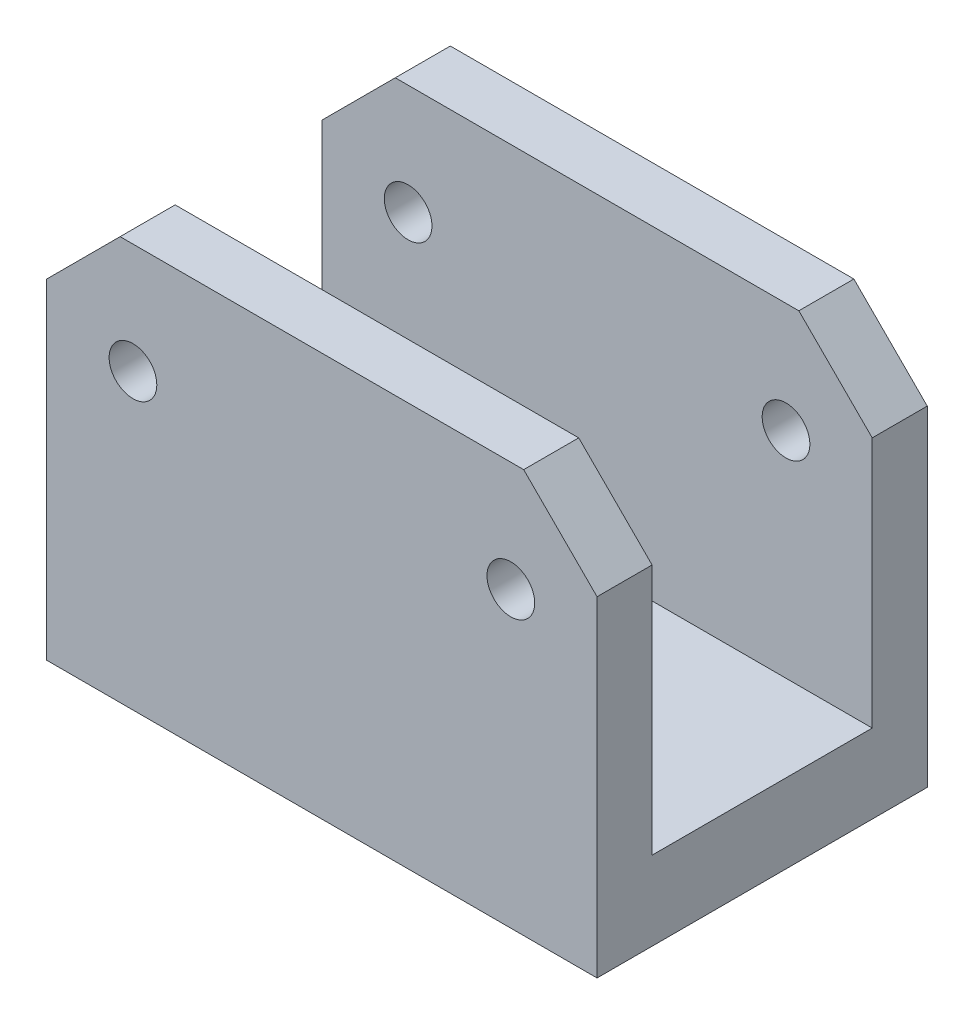
ISO-10303-21;
HEADER;
FILE_DESCRIPTION(('STEP AP214'),'2;1');
FILE_NAME('part.step','',(''),(''),'','','');
FILE_SCHEMA(('AUTOMOTIVE_DESIGN { 1 0 10303 214 1 1 1 1 }'));
ENDSEC;
DATA;
#1=APPLICATION_CONTEXT('core data for automotive mechanical design processes');
#2=APPLICATION_PROTOCOL_DEFINITION('international standard','automotive_design',2000,#1);
#3=PRODUCT_CONTEXT('',#1,'mechanical');
#4=PRODUCT('Part','Part','',(#3));
#5=PRODUCT_RELATED_PRODUCT_CATEGORY('part','',(#4));
#6=PRODUCT_DEFINITION_FORMATION('','',#4);
#7=PRODUCT_DEFINITION_CONTEXT('part definition',#1,'design');
#8=PRODUCT_DEFINITION('design','',#6,#7);
#9=PRODUCT_DEFINITION_SHAPE('','',#8);
#10=(LENGTH_UNIT() NAMED_UNIT(*) SI_UNIT(.MILLI.,.METRE.));
#11=(NAMED_UNIT(*) PLANE_ANGLE_UNIT() SI_UNIT($,.RADIAN.));
#12=(NAMED_UNIT(*) SI_UNIT($,.STERADIAN.) SOLID_ANGLE_UNIT());
#13=UNCERTAINTY_MEASURE_WITH_UNIT(LENGTH_MEASURE(1.E-05),#10,'distance_accuracy_value','');
#14=(GEOMETRIC_REPRESENTATION_CONTEXT(3) GLOBAL_UNCERTAINTY_ASSIGNED_CONTEXT((#13)) GLOBAL_UNIT_ASSIGNED_CONTEXT((#10,
#11,#12)) REPRESENTATION_CONTEXT('',''));
#15=CARTESIAN_POINT('',(0.,0.,0.));
#16=DIRECTION('',(0.,0.,1.));
#17=DIRECTION('',(1.,0.,0.));
#18=AXIS2_PLACEMENT_3D('',#15,#16,#17);
#19=CARTESIAN_POINT('',(15.,7.,9.));
#20=DIRECTION('',(-0.707106781186547,-0.707106781186547,0.));
#21=DIRECTION('',(0.707106781186548,-0.707106781186548,0.));
#22=AXIS2_PLACEMENT_3D('',#19,#20,#21);
#23=PLANE('',#22);
#24=DIRECTION('',(0.707106781186548,-0.707106781186548,0.));
#25=VECTOR('',#24,1.);
#26=CARTESIAN_POINT('',(15.,7.,6.));
#27=LINE('',#26,#25);
#28=CARTESIAN_POINT('',(11.,11.,6.));
#29=VERTEX_POINT('',#28);
#30=CARTESIAN_POINT('',(15.,6.99999999999998,6.));
#31=VERTEX_POINT('',#30);
#32=EDGE_CURVE('E192',#29,#31,#27,.T.);
#33=ORIENTED_EDGE('',*,*,#32,.F.);
#34=DIRECTION('',(0.,0.,-1.));
#35=VECTOR('',#34,1.);
#36=CARTESIAN_POINT('',(11.,11.,9.));
#37=LINE('',#36,#35);
#38=CARTESIAN_POINT('',(11.,11.,9.));
#39=VERTEX_POINT('',#38);
#40=EDGE_CURVE('E164',#39,#29,#37,.T.);
#41=ORIENTED_EDGE('',*,*,#40,.F.);
#42=DIRECTION('',(-0.707106781186548,0.707106781186548,0.));
#43=VECTOR('',#42,1.);
#44=CARTESIAN_POINT('',(15.,7.,9.));
#45=LINE('',#44,#43);
#46=CARTESIAN_POINT('',(15.,7.,9.));
#47=VERTEX_POINT('',#46);
#48=EDGE_CURVE('E100',#47,#39,#45,.T.);
#49=ORIENTED_EDGE('',*,*,#48,.F.);
#50=DIRECTION('',(0.,0.,-1.));
#51=VECTOR('',#50,1.);
#52=CARTESIAN_POINT('',(15.,7.,9.));
#53=LINE('',#52,#51);
#54=EDGE_CURVE('E11',#47,#31,#53,.T.);
#55=ORIENTED_EDGE('',*,*,#54,.T.);
#56=EDGE_LOOP('',(#33,#41,#49,#55));
#57=FACE_BOUND('',#56,.T.);
#58=ADVANCED_FACE('F39',(#57),#23,.F.);
#59=CARTESIAN_POINT('',(-11.,11.,9.));
#60=DIRECTION('',(0.,-1.,0.));
#61=DIRECTION('',(0.,0.,-1.));
#62=AXIS2_PLACEMENT_3D('',#59,#60,#61);
#63=PLANE('',#62);
#64=DIRECTION('',(1.,0.,0.));
#65=VECTOR('',#64,1.);
#66=CARTESIAN_POINT('',(-11.,11.,6.));
#67=LINE('',#66,#65);
#68=CARTESIAN_POINT('',(-11.,11.,6.));
#69=VERTEX_POINT('',#68);
#70=EDGE_CURVE('E189',#69,#29,#67,.T.);
#71=ORIENTED_EDGE('',*,*,#70,.F.);
#72=DIRECTION('',(0.,0.,-1.));
#73=VECTOR('',#72,1.);
#74=CARTESIAN_POINT('',(-11.,11.,9.));
#75=LINE('',#74,#73);
#76=CARTESIAN_POINT('',(-11.,11.,9.));
#77=VERTEX_POINT('',#76);
#78=EDGE_CURVE('E161',#77,#69,#75,.T.);
#79=ORIENTED_EDGE('',*,*,#78,.F.);
#80=DIRECTION('',(-1.,0.,0.));
#81=VECTOR('',#80,1.);
#82=CARTESIAN_POINT('',(-11.,11.,9.));
#83=LINE('',#82,#81);
#84=EDGE_CURVE('E117',#39,#77,#83,.T.);
#85=ORIENTED_EDGE('',*,*,#84,.F.);
#86=ORIENTED_EDGE('',*,*,#40,.T.);
#87=EDGE_LOOP('',(#71,#79,#85,#86));
#88=FACE_BOUND('',#87,.T.);
#89=ADVANCED_FACE('F225',(#88),#63,.F.);
#90=CARTESIAN_POINT('',(-15.,7.,9.));
#91=DIRECTION('',(0.707106781186547,-0.707106781186547,0.));
#92=DIRECTION('',(0.707106781186548,0.707106781186548,0.));
#93=AXIS2_PLACEMENT_3D('',#90,#91,#92);
#94=PLANE('',#93);
#95=DIRECTION('',(0.707106781186548,0.707106781186548,0.));
#96=VECTOR('',#95,1.);
#97=CARTESIAN_POINT('',(-15.,7.,6.));
#98=LINE('',#97,#96);
#99=CARTESIAN_POINT('',(-15.,7.,6.));
#100=VERTEX_POINT('',#99);
#101=EDGE_CURVE('E128',#100,#69,#98,.T.);
#102=ORIENTED_EDGE('',*,*,#101,.F.);
#103=DIRECTION('',(0.,0.,-1.));
#104=VECTOR('',#103,1.);
#105=CARTESIAN_POINT('',(-15.,7.,9.));
#106=LINE('',#105,#104);
#107=CARTESIAN_POINT('',(-15.,7.,9.));
#108=VERTEX_POINT('',#107);
#109=EDGE_CURVE('E124',#108,#100,#106,.T.);
#110=ORIENTED_EDGE('',*,*,#109,.F.);
#111=DIRECTION('',(-0.707106781186548,-0.707106781186548,0.));
#112=VECTOR('',#111,1.);
#113=CARTESIAN_POINT('',(-15.,7.,9.));
#114=LINE('',#113,#112);
#115=EDGE_CURVE('E109',#77,#108,#114,.T.);
#116=ORIENTED_EDGE('',*,*,#115,.F.);
#117=ORIENTED_EDGE('',*,*,#78,.T.);
#118=EDGE_LOOP('',(#102,#110,#116,#117));
#119=FACE_BOUND('',#118,.T.);
#120=ADVANCED_FACE('F125',(#119),#94,.F.);
#121=CARTESIAN_POINT('',(-10.3,5.,9.));
#122=DIRECTION('',(0.,0.,-1.));
#123=DIRECTION('',(-1.,0.,0.));
#124=AXIS2_PLACEMENT_3D('',#121,#122,#123);
#125=CYLINDRICAL_SURFACE('',#124,1.3);
#126=CARTESIAN_POINT('',(-10.3,5.,9.));
#127=DIRECTION('',(0.,0.,1.));
#128=DIRECTION('',(1.,0.,0.));
#129=AXIS2_PLACEMENT_3D('',#126,#127,#128);
#130=CIRCLE('',#129,1.3);
#131=CARTESIAN_POINT('',(-9.,5.,9.));
#132=VERTEX_POINT('',#131);
#133=EDGE_CURVE('E146',#132,#132,#130,.T.);
#134=ORIENTED_EDGE('',*,*,#133,.T.);
#135=EDGE_LOOP('',(#134));
#136=FACE_BOUND('',#135,.T.);
#137=CARTESIAN_POINT('',(-10.3,5.,6.));
#138=DIRECTION('',(0.,0.,-1.));
#139=DIRECTION('',(-1.,0.,0.));
#140=AXIS2_PLACEMENT_3D('',#137,#138,#139);
#141=CIRCLE('',#140,1.3);
#142=CARTESIAN_POINT('',(-11.6,5.,6.));
#143=VERTEX_POINT('',#142);
#144=EDGE_CURVE('E168',#143,#143,#141,.T.);
#145=ORIENTED_EDGE('',*,*,#144,.T.);
#146=EDGE_LOOP('',(#145));
#147=FACE_BOUND('',#146,.T.);
#148=ADVANCED_FACE('F322',(#136,#147),#125,.F.);
#149=CARTESIAN_POINT('',(10.3,5.,9.));
#150=DIRECTION('',(0.,0.,-1.));
#151=DIRECTION('',(-1.,0.,0.));
#152=AXIS2_PLACEMENT_3D('',#149,#150,#151);
#153=CYLINDRICAL_SURFACE('',#152,1.3);
#154=CARTESIAN_POINT('',(10.3,5.,9.));
#155=DIRECTION('',(0.,0.,1.));
#156=DIRECTION('',(-1.,0.,0.));
#157=AXIS2_PLACEMENT_3D('',#154,#155,#156);
#158=CIRCLE('',#157,1.3);
#159=CARTESIAN_POINT('',(9.,5.,9.));
#160=VERTEX_POINT('',#159);
#161=EDGE_CURVE('E208',#160,#160,#158,.T.);
#162=ORIENTED_EDGE('',*,*,#161,.T.);
#163=EDGE_LOOP('',(#162));
#164=FACE_BOUND('',#163,.T.);
#165=CARTESIAN_POINT('',(10.3,5.,6.));
#166=DIRECTION('',(0.,0.,-1.));
#167=DIRECTION('',(-1.,0.,0.));
#168=AXIS2_PLACEMENT_3D('',#165,#166,#167);
#169=CIRCLE('',#168,1.3);
#170=CARTESIAN_POINT('',(9.,5.,6.));
#171=VERTEX_POINT('',#170);
#172=EDGE_CURVE('E166',#171,#171,#169,.T.);
#173=ORIENTED_EDGE('',*,*,#172,.T.);
#174=EDGE_LOOP('',(#173));
#175=FACE_BOUND('',#174,.T.);
#176=ADVANCED_FACE('F334',(#164,#175),#153,.F.);
#177=CARTESIAN_POINT('',(0.,0.,9.));
#178=DIRECTION('',(0.,0.,1.));
#179=DIRECTION('',(1.,0.,0.));
#180=AXIS2_PLACEMENT_3D('',#177,#178,#179);
#181=PLANE('',#180);
#182=ORIENTED_EDGE('',*,*,#133,.F.);
#183=EDGE_LOOP('',(#182));
#184=FACE_BOUND('',#183,.T.);
#185=DIRECTION('',(0.,1.,0.));
#186=VECTOR('',#185,1.);
#187=CARTESIAN_POINT('',(15.,7.,9.));
#188=LINE('',#187,#186);
#189=CARTESIAN_POINT('',(15.,-11.,9.));
#190=VERTEX_POINT('',#189);
#191=EDGE_CURVE('E158',#190,#47,#188,.T.);
#192=ORIENTED_EDGE('',*,*,#191,.T.);
#193=ORIENTED_EDGE('',*,*,#48,.T.);
#194=ORIENTED_EDGE('',*,*,#84,.T.);
#195=ORIENTED_EDGE('',*,*,#115,.T.);
#196=DIRECTION('',(0.,-1.,0.));
#197=VECTOR('',#196,1.);
#198=CARTESIAN_POINT('',(-15.,7.,9.));
#199=LINE('',#198,#197);
#200=CARTESIAN_POINT('',(-15.,-11.,9.));
#201=VERTEX_POINT('',#200);
#202=EDGE_CURVE('E114',#108,#201,#199,.T.);
#203=ORIENTED_EDGE('',*,*,#202,.T.);
#204=DIRECTION('',(1.,0.,0.));
#205=VECTOR('',#204,1.);
#206=CARTESIAN_POINT('',(-15.,-11.,9.));
#207=LINE('',#206,#205);
#208=EDGE_CURVE('E65',#201,#190,#207,.T.);
#209=ORIENTED_EDGE('',*,*,#208,.T.);
#210=EDGE_LOOP('',(#192,#193,#194,#195,#203,#209));
#211=FACE_BOUND('',#210,.T.);
#212=ORIENTED_EDGE('',*,*,#161,.F.);
#213=EDGE_LOOP('',(#212));
#214=FACE_BOUND('',#213,.T.);
#215=ADVANCED_FACE('F111',(#184,#211,#214),#181,.T.);
#216=CARTESIAN_POINT('',(0.,0.,-9.));
#217=DIRECTION('',(0.,0.,1.));
#218=DIRECTION('',(1.,0.,0.));
#219=AXIS2_PLACEMENT_3D('',#216,#217,#218);
#220=PLANE('',#219);
#221=DIRECTION('',(0.,1.,0.));
#222=VECTOR('',#221,1.);
#223=CARTESIAN_POINT('',(15.,7.,-9.));
#224=LINE('',#223,#222);
#225=CARTESIAN_POINT('',(15.,-11.,-9.));
#226=VERTEX_POINT('',#225);
#227=CARTESIAN_POINT('',(15.,7.,-9.));
#228=VERTEX_POINT('',#227);
#229=EDGE_CURVE('E142',#226,#228,#224,.T.);
#230=ORIENTED_EDGE('',*,*,#229,.F.);
#231=DIRECTION('',(1.,0.,0.));
#232=VECTOR('',#231,1.);
#233=CARTESIAN_POINT('',(-15.,-11.,-9.));
#234=LINE('',#233,#232);
#235=CARTESIAN_POINT('',(-15.,-11.,-9.));
#236=VERTEX_POINT('',#235);
#237=EDGE_CURVE('E92',#236,#226,#234,.T.);
#238=ORIENTED_EDGE('',*,*,#237,.F.);
#239=DIRECTION('',(0.,-1.,0.));
#240=VECTOR('',#239,1.);
#241=CARTESIAN_POINT('',(-15.,7.,-9.));
#242=LINE('',#241,#240);
#243=CARTESIAN_POINT('',(-15.,7.,-9.));
#244=VERTEX_POINT('',#243);
#245=EDGE_CURVE('E155',#244,#236,#242,.T.);
#246=ORIENTED_EDGE('',*,*,#245,.F.);
#247=DIRECTION('',(-0.707106781186548,-0.707106781186548,0.));
#248=VECTOR('',#247,1.);
#249=CARTESIAN_POINT('',(-15.,7.,-9.));
#250=LINE('',#249,#248);
#251=CARTESIAN_POINT('',(-11.,11.,-9.));
#252=VERTEX_POINT('',#251);
#253=EDGE_CURVE('E152',#252,#244,#250,.T.);
#254=ORIENTED_EDGE('',*,*,#253,.F.);
#255=DIRECTION('',(-1.,0.,0.));
#256=VECTOR('',#255,1.);
#257=CARTESIAN_POINT('',(-11.,11.,-9.));
#258=LINE('',#257,#256);
#259=CARTESIAN_POINT('',(11.,11.,-9.));
#260=VERTEX_POINT('',#259);
#261=EDGE_CURVE('E149',#260,#252,#258,.T.);
#262=ORIENTED_EDGE('',*,*,#261,.F.);
#263=DIRECTION('',(-0.707106781186548,0.707106781186548,0.));
#264=VECTOR('',#263,1.);
#265=CARTESIAN_POINT('',(15.,7.,-9.));
#266=LINE('',#265,#264);
#267=EDGE_CURVE('E145',#228,#260,#266,.T.);
#268=ORIENTED_EDGE('',*,*,#267,.F.);
#269=EDGE_LOOP('',(#230,#238,#246,#254,#262,#268));
#270=FACE_BOUND('',#269,.T.);
#271=CARTESIAN_POINT('',(-10.3,5.,-9.));
#272=DIRECTION('',(0.,0.,1.));
#273=DIRECTION('',(1.,0.,0.));
#274=AXIS2_PLACEMENT_3D('',#271,#272,#273);
#275=CIRCLE('',#274,1.3);
#276=CARTESIAN_POINT('',(-9.,5.,-9.));
#277=VERTEX_POINT('',#276);
#278=EDGE_CURVE('E211',#277,#277,#275,.T.);
#279=ORIENTED_EDGE('',*,*,#278,.T.);
#280=EDGE_LOOP('',(#279));
#281=FACE_BOUND('',#280,.T.);
#282=CARTESIAN_POINT('',(10.3,5.,-9.));
#283=DIRECTION('',(0.,0.,1.));
#284=DIRECTION('',(-1.,0.,0.));
#285=AXIS2_PLACEMENT_3D('',#282,#283,#284);
#286=CIRCLE('',#285,1.3);
#287=CARTESIAN_POINT('',(9.,5.,-9.));
#288=VERTEX_POINT('',#287);
#289=EDGE_CURVE('E207',#288,#288,#286,.T.);
#290=ORIENTED_EDGE('',*,*,#289,.T.);
#291=EDGE_LOOP('',(#290));
#292=FACE_BOUND('',#291,.T.);
#293=ADVANCED_FACE('F256',(#270,#281,#292),#220,.F.);
#294=CARTESIAN_POINT('',(15.,7.,9.));
#295=DIRECTION('',(-1.,0.,0.));
#296=DIRECTION('',(0.,-1.,0.));
#297=AXIS2_PLACEMENT_3D('',#294,#295,#296);
#298=PLANE('',#297);
#299=CARTESIAN_POINT('',(15.,6.99999999999998,-6.));
#300=VERTEX_POINT('',#299);
#301=EDGE_CURVE('E48',#300,#228,#53,.T.);
#302=ORIENTED_EDGE('',*,*,#301,.F.);
#303=DIRECTION('',(0.,1.,0.));
#304=VECTOR('',#303,1.);
#305=CARTESIAN_POINT('',(15.,-6.7,-6.));
#306=LINE('',#305,#304);
#307=CARTESIAN_POINT('',(15.,-6.7,-6.));
#308=VERTEX_POINT('',#307);
#309=EDGE_CURVE('E182',#308,#300,#306,.T.);
#310=ORIENTED_EDGE('',*,*,#309,.F.);
#311=DIRECTION('',(0.,0.,1.));
#312=VECTOR('',#311,1.);
#313=CARTESIAN_POINT('',(15.,-6.7,-6.));
#314=LINE('',#313,#312);
#315=CARTESIAN_POINT('',(15.,-6.7,6.));
#316=VERTEX_POINT('',#315);
#317=EDGE_CURVE('E169',#308,#316,#314,.T.);
#318=ORIENTED_EDGE('',*,*,#317,.T.);
#319=DIRECTION('',(0.,1.,0.));
#320=VECTOR('',#319,1.);
#321=CARTESIAN_POINT('',(15.,-6.7,6.));
#322=LINE('',#321,#320);
#323=EDGE_CURVE('E185',#316,#31,#322,.T.);
#324=ORIENTED_EDGE('',*,*,#323,.T.);
#325=ORIENTED_EDGE('',*,*,#54,.F.);
#326=ORIENTED_EDGE('',*,*,#191,.F.);
#327=DIRECTION('',(0.,0.,-1.));
#328=VECTOR('',#327,1.);
#329=CARTESIAN_POINT('',(15.,-11.,9.));
#330=LINE('',#329,#328);
#331=EDGE_CURVE('E138',#190,#226,#330,.T.);
#332=ORIENTED_EDGE('',*,*,#331,.T.);
#333=ORIENTED_EDGE('',*,*,#229,.T.);
#334=EDGE_LOOP('',(#302,#310,#318,#324,#325,#326,#332,#333));
#335=FACE_BOUND('',#334,.T.);
#336=ADVANCED_FACE('F41',(#335),#298,.F.);
#337=CARTESIAN_POINT('',(11.,11.,-6.));
#338=VERTEX_POINT('',#337);
#339=EDGE_CURVE('E163',#338,#260,#37,.T.);
#340=ORIENTED_EDGE('',*,*,#339,.F.);
#341=DIRECTION('',(0.707106781186548,-0.707106781186548,0.));
#342=VECTOR('',#341,1.);
#343=CARTESIAN_POINT('',(15.,7.,-6.));
#344=LINE('',#343,#342);
#345=EDGE_CURVE('E204',#338,#300,#344,.T.);
#346=ORIENTED_EDGE('',*,*,#345,.T.);
#347=ORIENTED_EDGE('',*,*,#301,.T.);
#348=ORIENTED_EDGE('',*,*,#267,.T.);
#349=EDGE_LOOP('',(#340,#346,#347,#348));
#350=FACE_BOUND('',#349,.T.);
#351=ADVANCED_FACE('F250',(#350),#23,.F.);
#352=CARTESIAN_POINT('',(-11.,11.,-6.));
#353=VERTEX_POINT('',#352);
#354=EDGE_CURVE('E131',#353,#252,#75,.T.);
#355=ORIENTED_EDGE('',*,*,#354,.F.);
#356=DIRECTION('',(1.,0.,0.));
#357=VECTOR('',#356,1.);
#358=CARTESIAN_POINT('',(-11.,11.,-6.));
#359=LINE('',#358,#357);
#360=EDGE_CURVE('E201',#353,#338,#359,.T.);
#361=ORIENTED_EDGE('',*,*,#360,.T.);
#362=ORIENTED_EDGE('',*,*,#339,.T.);
#363=ORIENTED_EDGE('',*,*,#261,.T.);
#364=EDGE_LOOP('',(#355,#361,#362,#363));
#365=FACE_BOUND('',#364,.T.);
#366=ADVANCED_FACE('F249',(#365),#63,.F.);
#367=CARTESIAN_POINT('',(-15.,7.,-6.));
#368=VERTEX_POINT('',#367);
#369=EDGE_CURVE('E132',#368,#244,#106,.T.);
#370=ORIENTED_EDGE('',*,*,#369,.F.);
#371=DIRECTION('',(0.707106781186548,0.707106781186548,0.));
#372=VECTOR('',#371,1.);
#373=CARTESIAN_POINT('',(-15.,7.,-6.));
#374=LINE('',#373,#372);
#375=EDGE_CURVE('E198',#368,#353,#374,.T.);
#376=ORIENTED_EDGE('',*,*,#375,.T.);
#377=ORIENTED_EDGE('',*,*,#354,.T.);
#378=ORIENTED_EDGE('',*,*,#253,.T.);
#379=EDGE_LOOP('',(#370,#376,#377,#378));
#380=FACE_BOUND('',#379,.T.);
#381=ADVANCED_FACE('F261',(#380),#94,.F.);
#382=CARTESIAN_POINT('',(-15.,7.,9.));
#383=DIRECTION('',(1.,0.,0.));
#384=DIRECTION('',(0.,1.,0.));
#385=AXIS2_PLACEMENT_3D('',#382,#383,#384);
#386=PLANE('',#385);
#387=DIRECTION('',(0.,0.,1.));
#388=VECTOR('',#387,1.);
#389=CARTESIAN_POINT('',(-15.,-6.7,-6.));
#390=LINE('',#389,#388);
#391=CARTESIAN_POINT('',(-15.,-6.7,-6.));
#392=VERTEX_POINT('',#391);
#393=CARTESIAN_POINT('',(-15.,-6.7,6.));
#394=VERTEX_POINT('',#393);
#395=EDGE_CURVE('E175',#392,#394,#390,.T.);
#396=ORIENTED_EDGE('',*,*,#395,.F.);
#397=DIRECTION('',(0.,-1.,0.));
#398=VECTOR('',#397,1.);
#399=CARTESIAN_POINT('',(-15.,-6.7,-6.));
#400=LINE('',#399,#398);
#401=EDGE_CURVE('E265',#368,#392,#400,.T.);
#402=ORIENTED_EDGE('',*,*,#401,.F.);
#403=ORIENTED_EDGE('',*,*,#369,.T.);
#404=ORIENTED_EDGE('',*,*,#245,.T.);
#405=DIRECTION('',(0.,0.,-1.));
#406=VECTOR('',#405,1.);
#407=CARTESIAN_POINT('',(-15.,-11.,9.));
#408=LINE('',#407,#406);
#409=EDGE_CURVE('E136',#201,#236,#408,.T.);
#410=ORIENTED_EDGE('',*,*,#409,.F.);
#411=ORIENTED_EDGE('',*,*,#202,.F.);
#412=ORIENTED_EDGE('',*,*,#109,.T.);
#413=DIRECTION('',(0.,-1.,0.));
#414=VECTOR('',#413,1.);
#415=CARTESIAN_POINT('',(-15.,-6.7,6.));
#416=LINE('',#415,#414);
#417=EDGE_CURVE('E275',#100,#394,#416,.T.);
#418=ORIENTED_EDGE('',*,*,#417,.T.);
#419=EDGE_LOOP('',(#396,#402,#403,#404,#410,#411,#412,#418));
#420=FACE_BOUND('',#419,.T.);
#421=ADVANCED_FACE('F135',(#420),#386,.F.);
#422=CARTESIAN_POINT('',(-15.,-11.,9.));
#423=DIRECTION('',(0.,1.,0.));
#424=DIRECTION('',(0.,0.,1.));
#425=AXIS2_PLACEMENT_3D('',#422,#423,#424);
#426=PLANE('',#425);
#427=CARTESIAN_POINT('',(0.,-11.,0.));
#428=DIRECTION('',(0.,1.,0.));
#429=DIRECTION('',(0.,0.,1.));
#430=AXIS2_PLACEMENT_3D('',#427,#428,#429);
#431=CIRCLE('',#430,1.25);
#432=CARTESIAN_POINT('',(0.,-11.,1.25));
#433=VERTEX_POINT('',#432);
#434=EDGE_CURVE('E271',#433,#433,#431,.F.);
#435=ORIENTED_EDGE('',*,*,#434,.F.);
#436=EDGE_LOOP('',(#435));
#437=FACE_BOUND('',#436,.T.);
#438=ORIENTED_EDGE('',*,*,#237,.T.);
#439=ORIENTED_EDGE('',*,*,#331,.F.);
#440=ORIENTED_EDGE('',*,*,#208,.F.);
#441=ORIENTED_EDGE('',*,*,#409,.T.);
#442=EDGE_LOOP('',(#438,#439,#440,#441));
#443=FACE_BOUND('',#442,.T.);
#444=ADVANCED_FACE('F311',(#437,#443),#426,.F.);
#445=CARTESIAN_POINT('',(-10.3,5.,-6.));
#446=DIRECTION('',(0.,0.,-1.));
#447=DIRECTION('',(-1.,0.,0.));
#448=AXIS2_PLACEMENT_3D('',#445,#446,#447);
#449=CIRCLE('',#448,1.3);
#450=CARTESIAN_POINT('',(-11.6,5.,-6.));
#451=VERTEX_POINT('',#450);
#452=EDGE_CURVE('E195',#451,#451,#449,.T.);
#453=ORIENTED_EDGE('',*,*,#452,.F.);
#454=EDGE_LOOP('',(#453));
#455=FACE_BOUND('',#454,.T.);
#456=ORIENTED_EDGE('',*,*,#278,.F.);
#457=EDGE_LOOP('',(#456));
#458=FACE_BOUND('',#457,.T.);
#459=ADVANCED_FACE('F313',(#455,#458),#125,.F.);
#460=CARTESIAN_POINT('',(10.3,5.,-6.));
#461=DIRECTION('',(0.,0.,-1.));
#462=DIRECTION('',(-1.,0.,0.));
#463=AXIS2_PLACEMENT_3D('',#460,#461,#462);
#464=CIRCLE('',#463,1.3);
#465=CARTESIAN_POINT('',(9.,5.,-6.));
#466=VERTEX_POINT('',#465);
#467=EDGE_CURVE('E43',#466,#466,#464,.T.);
#468=ORIENTED_EDGE('',*,*,#467,.F.);
#469=EDGE_LOOP('',(#468));
#470=FACE_BOUND('',#469,.T.);
#471=ORIENTED_EDGE('',*,*,#289,.F.);
#472=EDGE_LOOP('',(#471));
#473=FACE_BOUND('',#472,.T.);
#474=ADVANCED_FACE('F293',(#470,#473),#153,.F.);
#475=CARTESIAN_POINT('',(0.,0.,-6.));
#476=DIRECTION('',(0.,0.,-1.));
#477=DIRECTION('',(-1.,0.,0.));
#478=AXIS2_PLACEMENT_3D('',#475,#476,#477);
#479=PLANE('',#478);
#480=ORIENTED_EDGE('',*,*,#452,.T.);
#481=EDGE_LOOP('',(#480));
#482=FACE_BOUND('',#481,.T.);
#483=ORIENTED_EDGE('',*,*,#467,.T.);
#484=EDGE_LOOP('',(#483));
#485=FACE_BOUND('',#484,.T.);
#486=ORIENTED_EDGE('',*,*,#360,.F.);
#487=ORIENTED_EDGE('',*,*,#375,.F.);
#488=ORIENTED_EDGE('',*,*,#401,.T.);
#489=DIRECTION('',(1.,0.,0.));
#490=VECTOR('',#489,1.);
#491=CARTESIAN_POINT('',(-15.,-6.7,-6.));
#492=LINE('',#491,#490);
#493=EDGE_CURVE('E267',#392,#308,#492,.T.);
#494=ORIENTED_EDGE('',*,*,#493,.T.);
#495=ORIENTED_EDGE('',*,*,#309,.T.);
#496=ORIENTED_EDGE('',*,*,#345,.F.);
#497=EDGE_LOOP('',(#486,#487,#488,#494,#495,#496));
#498=FACE_BOUND('',#497,.T.);
#499=ADVANCED_FACE('F242',(#482,#485,#498),#479,.F.);
#500=CARTESIAN_POINT('',(0.,0.,6.));
#501=DIRECTION('',(0.,0.,-1.));
#502=DIRECTION('',(-1.,0.,0.));
#503=AXIS2_PLACEMENT_3D('',#500,#501,#502);
#504=PLANE('',#503);
#505=ORIENTED_EDGE('',*,*,#172,.F.);
#506=EDGE_LOOP('',(#505));
#507=FACE_BOUND('',#506,.T.);
#508=ORIENTED_EDGE('',*,*,#144,.F.);
#509=EDGE_LOOP('',(#508));
#510=FACE_BOUND('',#509,.T.);
#511=ORIENTED_EDGE('',*,*,#32,.T.);
#512=ORIENTED_EDGE('',*,*,#323,.F.);
#513=DIRECTION('',(1.,0.,0.));
#514=VECTOR('',#513,1.);
#515=CARTESIAN_POINT('',(-15.,-6.7,6.));
#516=LINE('',#515,#514);
#517=EDGE_CURVE('E56',#394,#316,#516,.T.);
#518=ORIENTED_EDGE('',*,*,#517,.F.);
#519=ORIENTED_EDGE('',*,*,#417,.F.);
#520=ORIENTED_EDGE('',*,*,#101,.T.);
#521=ORIENTED_EDGE('',*,*,#70,.T.);
#522=EDGE_LOOP('',(#511,#512,#518,#519,#520,#521));
#523=FACE_BOUND('',#522,.T.);
#524=ADVANCED_FACE('F282',(#507,#510,#523),#504,.T.);
#525=CARTESIAN_POINT('',(-15.,-6.7,-6.));
#526=DIRECTION('',(0.,-1.,0.));
#527=DIRECTION('',(0.,0.,-1.));
#528=AXIS2_PLACEMENT_3D('',#525,#526,#527);
#529=PLANE('',#528);
#530=CARTESIAN_POINT('',(0.,-6.7,0.));
#531=DIRECTION('',(0.,-1.,0.));
#532=DIRECTION('',(0.,0.,-1.));
#533=AXIS2_PLACEMENT_3D('',#530,#531,#532);
#534=CIRCLE('',#533,1.25);
#535=CARTESIAN_POINT('',(0.,-6.7,-1.25));
#536=VERTEX_POINT('',#535);
#537=EDGE_CURVE('E466',#536,#536,#534,.F.);
#538=ORIENTED_EDGE('',*,*,#537,.F.);
#539=EDGE_LOOP('',(#538));
#540=FACE_BOUND('',#539,.T.);
#541=ORIENTED_EDGE('',*,*,#517,.T.);
#542=ORIENTED_EDGE('',*,*,#317,.F.);
#543=ORIENTED_EDGE('',*,*,#493,.F.);
#544=ORIENTED_EDGE('',*,*,#395,.T.);
#545=EDGE_LOOP('',(#541,#542,#543,#544));
#546=FACE_BOUND('',#545,.T.);
#547=ADVANCED_FACE('F277',(#540,#546),#529,.F.);
#548=CARTESIAN_POINT('',(0.,-11.001,0.));
#549=DIRECTION('',(0.,1.,0.));
#550=DIRECTION('',(0.,0.,1.));
#551=AXIS2_PLACEMENT_3D('',#548,#549,#550);
#552=CYLINDRICAL_SURFACE('',#551,1.25);
#553=ORIENTED_EDGE('',*,*,#537,.T.);
#554=EDGE_LOOP('',(#553));
#555=FACE_BOUND('',#554,.T.);
#556=ORIENTED_EDGE('',*,*,#434,.T.);
#557=EDGE_LOOP('',(#556));
#558=FACE_BOUND('',#557,.T.);
#559=ADVANCED_FACE('F290',(#555,#558),#552,.F.);
#560=CLOSED_SHELL('',(#58,#89,#120,#148,#176,#215,#293,#336,#351,#366,#381,#421,#444,#459,#474,
#499,#524,#547,#559));
#561=MANIFOLD_SOLID_BREP('B2',#560);
#562=ADVANCED_BREP_SHAPE_REPRESENTATION('',(#18,#561),#14);
#563=SHAPE_DEFINITION_REPRESENTATION(#9,#562);
ENDSEC;
END-ISO-10303-21;
